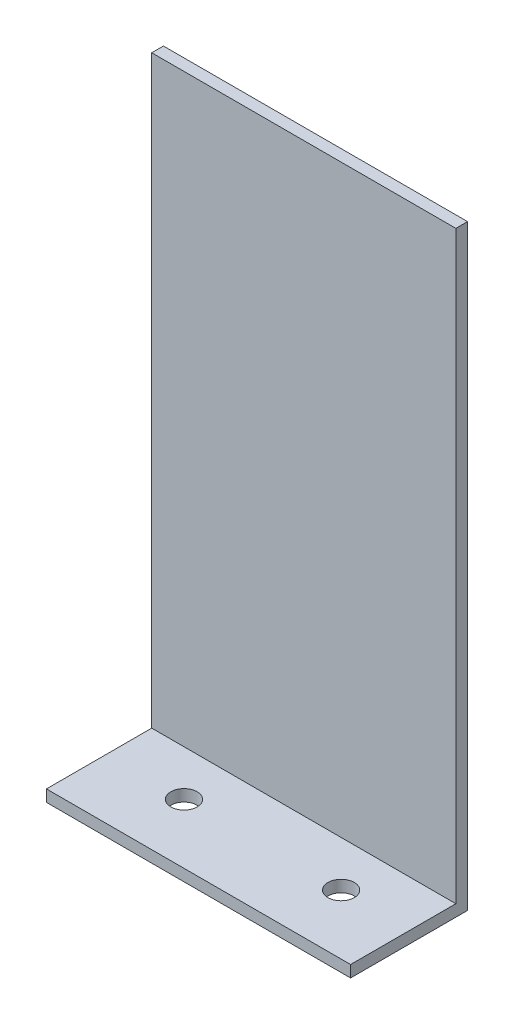
ISO-10303-21;
HEADER;
FILE_DESCRIPTION(('STEP AP214'),'2;1');
FILE_NAME('part.step','',(''),(''),'','','');
FILE_SCHEMA(('AUTOMOTIVE_DESIGN { 1 0 10303 214 1 1 1 1 }'));
ENDSEC;
DATA;
#1=APPLICATION_CONTEXT('core data for automotive mechanical design processes');
#2=APPLICATION_PROTOCOL_DEFINITION('international standard','automotive_design',2000,#1);
#3=PRODUCT_CONTEXT('',#1,'mechanical');
#4=PRODUCT('Part','Part','',(#3));
#5=PRODUCT_RELATED_PRODUCT_CATEGORY('part','',(#4));
#6=PRODUCT_DEFINITION_FORMATION('','',#4);
#7=PRODUCT_DEFINITION_CONTEXT('part definition',#1,'design');
#8=PRODUCT_DEFINITION('design','',#6,#7);
#9=PRODUCT_DEFINITION_SHAPE('','',#8);
#10=(LENGTH_UNIT() NAMED_UNIT(*) SI_UNIT(.MILLI.,.METRE.));
#11=(NAMED_UNIT(*) PLANE_ANGLE_UNIT() SI_UNIT($,.RADIAN.));
#12=(NAMED_UNIT(*) SI_UNIT($,.STERADIAN.) SOLID_ANGLE_UNIT());
#13=UNCERTAINTY_MEASURE_WITH_UNIT(LENGTH_MEASURE(1.E-05),#10,'distance_accuracy_value','');
#14=(GEOMETRIC_REPRESENTATION_CONTEXT(3) GLOBAL_UNCERTAINTY_ASSIGNED_CONTEXT((#13)) GLOBAL_UNIT_ASSIGNED_CONTEXT((#10,
#11,#12)) REPRESENTATION_CONTEXT('',''));
#15=CARTESIAN_POINT('',(0.,0.,0.));
#16=DIRECTION('',(0.,0.,1.));
#17=DIRECTION('',(1.,0.,0.));
#18=AXIS2_PLACEMENT_3D('',#15,#16,#17);
#19=CARTESIAN_POINT('',(0.,0.,20.));
#20=DIRECTION('',(0.,0.,-1.));
#21=DIRECTION('',(-1.,0.,0.));
#22=AXIS2_PLACEMENT_3D('',#19,#20,#21);
#23=PLANE('',#22);
#24=DIRECTION('',(1.,0.,0.));
#25=VECTOR('',#24,1.);
#26=CARTESIAN_POINT('',(0.,-49.,20.));
#27=LINE('',#26,#25);
#28=CARTESIAN_POINT('',(-26.,-49.,20.));
#29=VERTEX_POINT('',#28);
#30=CARTESIAN_POINT('',(26.,-49.,20.));
#31=VERTEX_POINT('',#30);
#32=EDGE_CURVE('E41',#29,#31,#27,.T.);
#33=ORIENTED_EDGE('',*,*,#32,.F.);
#34=DIRECTION('',(0.,-1.,0.));
#35=VECTOR('',#34,1.);
#36=CARTESIAN_POINT('',(-26.,-51.,20.));
#37=LINE('',#36,#35);
#38=CARTESIAN_POINT('',(-26.,-51.,20.));
#39=VERTEX_POINT('',#38);
#40=EDGE_CURVE('E121',#29,#39,#37,.T.);
#41=ORIENTED_EDGE('',*,*,#40,.T.);
#42=DIRECTION('',(1.,0.,0.));
#43=VECTOR('',#42,1.);
#44=CARTESIAN_POINT('',(-26.,-51.,20.));
#45=LINE('',#44,#43);
#46=CARTESIAN_POINT('',(26.,-51.,20.));
#47=VERTEX_POINT('',#46);
#48=EDGE_CURVE('E57',#39,#47,#45,.T.);
#49=ORIENTED_EDGE('',*,*,#48,.T.);
#50=DIRECTION('',(0.,1.,0.));
#51=VECTOR('',#50,1.);
#52=CARTESIAN_POINT('',(26.,-51.,20.));
#53=LINE('',#52,#51);
#54=EDGE_CURVE('E86',#47,#31,#53,.T.);
#55=ORIENTED_EDGE('',*,*,#54,.T.);
#56=EDGE_LOOP('',(#33,#41,#49,#55));
#57=FACE_BOUND('',#56,.T.);
#58=ADVANCED_FACE('F33',(#57),#23,.F.);
#59=CARTESIAN_POINT('',(26.,-51.,20.));
#60=DIRECTION('',(-1.,0.,0.));
#61=DIRECTION('',(0.,0.,1.));
#62=AXIS2_PLACEMENT_3D('',#59,#60,#61);
#63=PLANE('',#62);
#64=DIRECTION('',(0.,0.,-1.));
#65=VECTOR('',#64,1.);
#66=CARTESIAN_POINT('',(26.,51.,20.));
#67=LINE('',#66,#65);
#68=CARTESIAN_POINT('',(26.,51.,2.));
#69=VERTEX_POINT('',#68);
#70=CARTESIAN_POINT('',(26.,51.,0.));
#71=VERTEX_POINT('',#70);
#72=EDGE_CURVE('E112',#69,#71,#67,.T.);
#73=ORIENTED_EDGE('',*,*,#72,.F.);
#74=DIRECTION('',(0.,-1.,0.));
#75=VECTOR('',#74,1.);
#76=CARTESIAN_POINT('',(26.,-51.,2.));
#77=LINE('',#76,#75);
#78=CARTESIAN_POINT('',(26.,-49.,2.));
#79=VERTEX_POINT('',#78);
#80=EDGE_CURVE('E99',#69,#79,#77,.T.);
#81=ORIENTED_EDGE('',*,*,#80,.T.);
#82=DIRECTION('',(0.,0.,-1.));
#83=VECTOR('',#82,1.);
#84=CARTESIAN_POINT('',(26.,-49.,20.));
#85=LINE('',#84,#83);
#86=EDGE_CURVE('E103',#31,#79,#85,.T.);
#87=ORIENTED_EDGE('',*,*,#86,.F.);
#88=ORIENTED_EDGE('',*,*,#54,.F.);
#89=DIRECTION('',(0.,0.,-1.));
#90=VECTOR('',#89,1.);
#91=CARTESIAN_POINT('',(26.,-51.,20.));
#92=LINE('',#91,#90);
#93=CARTESIAN_POINT('',(26.,-51.,0.));
#94=VERTEX_POINT('',#93);
#95=EDGE_CURVE('E79',#47,#94,#92,.T.);
#96=ORIENTED_EDGE('',*,*,#95,.T.);
#97=DIRECTION('',(0.,1.,0.));
#98=VECTOR('',#97,1.);
#99=CARTESIAN_POINT('',(26.,-51.,0.));
#100=LINE('',#99,#98);
#101=EDGE_CURVE('E92',#94,#71,#100,.T.);
#102=ORIENTED_EDGE('',*,*,#101,.T.);
#103=EDGE_LOOP('',(#73,#81,#87,#88,#96,#102));
#104=FACE_BOUND('',#103,.T.);
#105=ADVANCED_FACE('F35',(#104),#63,.F.);
#106=CARTESIAN_POINT('',(-26.,51.,20.));
#107=DIRECTION('',(0.,-1.,0.));
#108=DIRECTION('',(0.,0.,-1.));
#109=AXIS2_PLACEMENT_3D('',#106,#107,#108);
#110=PLANE('',#109);
#111=DIRECTION('',(0.,0.,-1.));
#112=VECTOR('',#111,1.);
#113=CARTESIAN_POINT('',(-26.,51.,20.));
#114=LINE('',#113,#112);
#115=CARTESIAN_POINT('',(-26.,51.,2.));
#116=VERTEX_POINT('',#115);
#117=CARTESIAN_POINT('',(-26.,51.,0.));
#118=VERTEX_POINT('',#117);
#119=EDGE_CURVE('E110',#116,#118,#114,.T.);
#120=ORIENTED_EDGE('',*,*,#119,.F.);
#121=DIRECTION('',(-1.,0.,0.));
#122=VECTOR('',#121,1.);
#123=CARTESIAN_POINT('',(34.4102153998165,51.,2.));
#124=LINE('',#123,#122);
#125=EDGE_CURVE('E126',#69,#116,#124,.T.);
#126=ORIENTED_EDGE('',*,*,#125,.F.);
#127=ORIENTED_EDGE('',*,*,#72,.T.);
#128=DIRECTION('',(-1.,0.,0.));
#129=VECTOR('',#128,1.);
#130=CARTESIAN_POINT('',(-26.,51.,0.));
#131=LINE('',#130,#129);
#132=EDGE_CURVE('E98',#71,#118,#131,.T.);
#133=ORIENTED_EDGE('',*,*,#132,.T.);
#134=EDGE_LOOP('',(#120,#126,#127,#133));
#135=FACE_BOUND('',#134,.T.);
#136=ADVANCED_FACE('F166',(#135),#110,.F.);
#137=CARTESIAN_POINT('',(-26.,-51.,20.));
#138=DIRECTION('',(1.,0.,0.));
#139=DIRECTION('',(0.,0.,-1.));
#140=AXIS2_PLACEMENT_3D('',#137,#138,#139);
#141=PLANE('',#140);
#142=DIRECTION('',(0.,0.,1.));
#143=VECTOR('',#142,1.);
#144=CARTESIAN_POINT('',(-26.,-49.,20.));
#145=LINE('',#144,#143);
#146=CARTESIAN_POINT('',(-26.,-49.,2.));
#147=VERTEX_POINT('',#146);
#148=EDGE_CURVE('E48',#147,#29,#145,.T.);
#149=ORIENTED_EDGE('',*,*,#148,.F.);
#150=DIRECTION('',(0.,1.,0.));
#151=VECTOR('',#150,1.);
#152=CARTESIAN_POINT('',(-26.,-51.,2.));
#153=LINE('',#152,#151);
#154=EDGE_CURVE('E11',#147,#116,#153,.T.);
#155=ORIENTED_EDGE('',*,*,#154,.T.);
#156=ORIENTED_EDGE('',*,*,#119,.T.);
#157=DIRECTION('',(0.,-1.,0.));
#158=VECTOR('',#157,1.);
#159=CARTESIAN_POINT('',(-26.,-51.,0.));
#160=LINE('',#159,#158);
#161=CARTESIAN_POINT('',(-26.,-51.,0.));
#162=VERTEX_POINT('',#161);
#163=EDGE_CURVE('E87',#118,#162,#160,.T.);
#164=ORIENTED_EDGE('',*,*,#163,.T.);
#165=DIRECTION('',(0.,0.,-1.));
#166=VECTOR('',#165,1.);
#167=CARTESIAN_POINT('',(-26.,-51.,20.));
#168=LINE('',#167,#166);
#169=EDGE_CURVE('E82',#39,#162,#168,.T.);
#170=ORIENTED_EDGE('',*,*,#169,.F.);
#171=ORIENTED_EDGE('',*,*,#40,.F.);
#172=EDGE_LOOP('',(#149,#155,#156,#164,#170,#171));
#173=FACE_BOUND('',#172,.T.);
#174=ADVANCED_FACE('F173',(#173),#141,.F.);
#175=CARTESIAN_POINT('',(-26.,-51.,20.));
#176=DIRECTION('',(0.,1.,0.));
#177=DIRECTION('',(0.,0.,1.));
#178=AXIS2_PLACEMENT_3D('',#175,#176,#177);
#179=PLANE('',#178);
#180=CARTESIAN_POINT('',(-12.695679617865,-51.,9.78506331878037));
#181=DIRECTION('',(0.,1.,0.));
#182=DIRECTION('',(0.,0.,1.));
#183=AXIS2_PLACEMENT_3D('',#180,#181,#182);
#184=CIRCLE('',#183,2.24999999999999);
#185=CARTESIAN_POINT('',(-12.695679617865,-51.,12.0350633187804));
#186=VERTEX_POINT('',#185);
#187=EDGE_CURVE('E136',#186,#186,#184,.T.);
#188=ORIENTED_EDGE('',*,*,#187,.T.);
#189=EDGE_LOOP('',(#188));
#190=FACE_BOUND('',#189,.T.);
#191=CARTESIAN_POINT('',(14.1630378381379,-51.,9.78506331878037));
#192=DIRECTION('',(0.,1.,0.));
#193=DIRECTION('',(0.,0.,1.));
#194=AXIS2_PLACEMENT_3D('',#191,#192,#193);
#195=CIRCLE('',#194,2.24999999999999);
#196=CARTESIAN_POINT('',(14.1630378381379,-51.,12.0350633187804));
#197=VERTEX_POINT('',#196);
#198=EDGE_CURVE('E129',#197,#197,#195,.T.);
#199=ORIENTED_EDGE('',*,*,#198,.T.);
#200=EDGE_LOOP('',(#199));
#201=FACE_BOUND('',#200,.T.);
#202=DIRECTION('',(1.,0.,0.));
#203=VECTOR('',#202,1.);
#204=CARTESIAN_POINT('',(-26.,-51.,0.));
#205=LINE('',#204,#203);
#206=EDGE_CURVE('E76',#162,#94,#205,.T.);
#207=ORIENTED_EDGE('',*,*,#206,.T.);
#208=ORIENTED_EDGE('',*,*,#95,.F.);
#209=ORIENTED_EDGE('',*,*,#48,.F.);
#210=ORIENTED_EDGE('',*,*,#169,.T.);
#211=EDGE_LOOP('',(#207,#208,#209,#210));
#212=FACE_BOUND('',#211,.T.);
#213=ADVANCED_FACE('F78',(#190,#201,#212),#179,.F.);
#214=CARTESIAN_POINT('',(0.,0.,0.));
#215=DIRECTION('',(0.,0.,-1.));
#216=DIRECTION('',(-1.,0.,0.));
#217=AXIS2_PLACEMENT_3D('',#214,#215,#216);
#218=PLANE('',#217);
#219=ORIENTED_EDGE('',*,*,#101,.F.);
#220=ORIENTED_EDGE('',*,*,#206,.F.);
#221=ORIENTED_EDGE('',*,*,#163,.F.);
#222=ORIENTED_EDGE('',*,*,#132,.F.);
#223=EDGE_LOOP('',(#219,#220,#221,#222));
#224=FACE_BOUND('',#223,.T.);
#225=ADVANCED_FACE('F96',(#224),#218,.T.);
#226=CARTESIAN_POINT('',(34.4102153998165,-49.,2.));
#227=DIRECTION('',(0.,0.,-1.));
#228=DIRECTION('',(-1.,0.,0.));
#229=AXIS2_PLACEMENT_3D('',#226,#227,#228);
#230=PLANE('',#229);
#231=ORIENTED_EDGE('',*,*,#125,.T.);
#232=ORIENTED_EDGE('',*,*,#154,.F.);
#233=DIRECTION('',(-1.,0.,0.));
#234=VECTOR('',#233,1.);
#235=CARTESIAN_POINT('',(34.4102153998165,-49.,2.));
#236=LINE('',#235,#234);
#237=EDGE_CURVE('E125',#79,#147,#236,.T.);
#238=ORIENTED_EDGE('',*,*,#237,.F.);
#239=ORIENTED_EDGE('',*,*,#80,.F.);
#240=EDGE_LOOP('',(#231,#232,#238,#239));
#241=FACE_BOUND('',#240,.T.);
#242=ADVANCED_FACE('F148',(#241),#230,.F.);
#243=CARTESIAN_POINT('',(0.,-49.,0.));
#244=DIRECTION('',(0.,1.,0.));
#245=DIRECTION('',(0.,0.,1.));
#246=AXIS2_PLACEMENT_3D('',#243,#244,#245);
#247=PLANE('',#246);
#248=CARTESIAN_POINT('',(-12.695679617865,-49.,9.78506331878037));
#249=DIRECTION('',(0.,1.,0.));
#250=DIRECTION('',(0.,0.,1.));
#251=AXIS2_PLACEMENT_3D('',#248,#249,#250);
#252=CIRCLE('',#251,2.24999999999999);
#253=CARTESIAN_POINT('',(-12.695679617865,-49.,12.0350633187804));
#254=VERTEX_POINT('',#253);
#255=EDGE_CURVE('E139',#254,#254,#252,.T.);
#256=ORIENTED_EDGE('',*,*,#255,.F.);
#257=EDGE_LOOP('',(#256));
#258=FACE_BOUND('',#257,.T.);
#259=CARTESIAN_POINT('',(14.1630378381379,-49.,9.78506331878037));
#260=DIRECTION('',(0.,1.,0.));
#261=DIRECTION('',(0.,0.,1.));
#262=AXIS2_PLACEMENT_3D('',#259,#260,#261);
#263=CIRCLE('',#262,2.24999999999999);
#264=CARTESIAN_POINT('',(14.1630378381379,-49.,12.0350633187804));
#265=VERTEX_POINT('',#264);
#266=EDGE_CURVE('E133',#265,#265,#263,.T.);
#267=ORIENTED_EDGE('',*,*,#266,.F.);
#268=EDGE_LOOP('',(#267));
#269=FACE_BOUND('',#268,.T.);
#270=ORIENTED_EDGE('',*,*,#86,.T.);
#271=ORIENTED_EDGE('',*,*,#237,.T.);
#272=ORIENTED_EDGE('',*,*,#148,.T.);
#273=ORIENTED_EDGE('',*,*,#32,.T.);
#274=EDGE_LOOP('',(#270,#271,#272,#273));
#275=FACE_BOUND('',#274,.T.);
#276=ADVANCED_FACE('F114',(#258,#269,#275),#247,.T.);
#277=CARTESIAN_POINT('',(14.1630378381379,-49.,9.78506331878037));
#278=DIRECTION('',(0.,1.,0.));
#279=DIRECTION('',(0.,0.,1.));
#280=AXIS2_PLACEMENT_3D('',#277,#278,#279);
#281=CYLINDRICAL_SURFACE('',#280,2.24999999999999);
#282=ORIENTED_EDGE('',*,*,#198,.F.);
#283=EDGE_LOOP('',(#282));
#284=FACE_BOUND('',#283,.T.);
#285=ORIENTED_EDGE('',*,*,#266,.T.);
#286=EDGE_LOOP('',(#285));
#287=FACE_BOUND('',#286,.T.);
#288=ADVANCED_FACE('F147',(#284,#287),#281,.F.);
#289=CARTESIAN_POINT('',(-12.695679617865,-49.,9.78506331878037));
#290=DIRECTION('',(0.,1.,0.));
#291=DIRECTION('',(0.,0.,1.));
#292=AXIS2_PLACEMENT_3D('',#289,#290,#291);
#293=CYLINDRICAL_SURFACE('',#292,2.24999999999999);
#294=ORIENTED_EDGE('',*,*,#187,.F.);
#295=EDGE_LOOP('',(#294));
#296=FACE_BOUND('',#295,.T.);
#297=ORIENTED_EDGE('',*,*,#255,.T.);
#298=EDGE_LOOP('',(#297));
#299=FACE_BOUND('',#298,.T.);
#300=ADVANCED_FACE('F143',(#296,#299),#293,.F.);
#301=CLOSED_SHELL('',(#58,#105,#136,#174,#213,#225,#242,#276,#288,#300));
#302=MANIFOLD_SOLID_BREP('B2',#301);
#303=ADVANCED_BREP_SHAPE_REPRESENTATION('',(#18,#302),#14);
#304=SHAPE_DEFINITION_REPRESENTATION(#9,#303);
ENDSEC;
END-ISO-10303-21;
